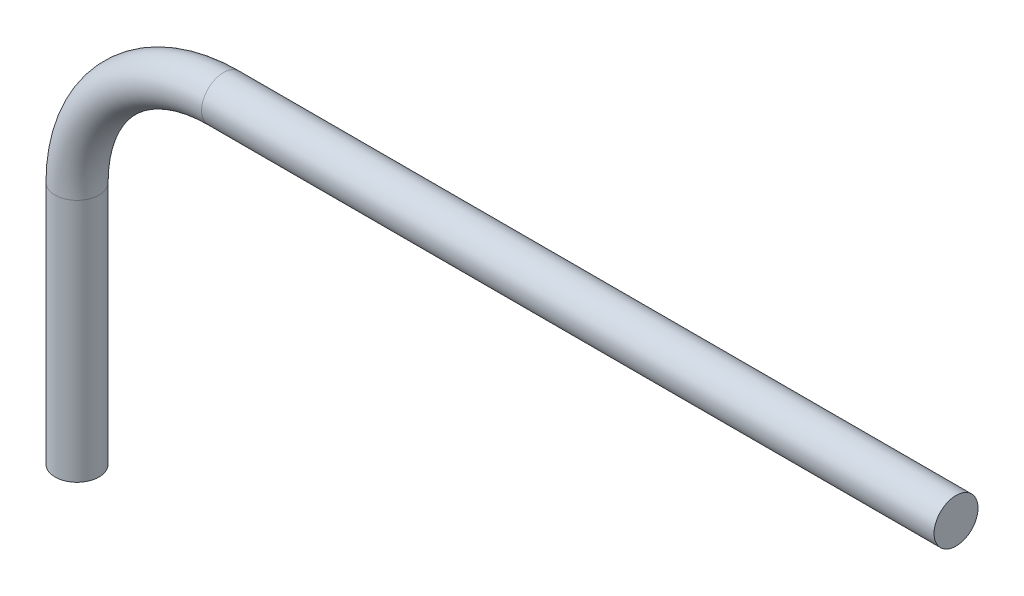
ISO-10303-21;
HEADER;
FILE_DESCRIPTION(('STEP AP214'),'2;1');
FILE_NAME('part.step','',(''),(''),'','','');
FILE_SCHEMA(('AUTOMOTIVE_DESIGN { 1 0 10303 214 1 1 1 1 }'));
ENDSEC;
DATA;
#1=APPLICATION_CONTEXT('core data for automotive mechanical design processes');
#2=APPLICATION_PROTOCOL_DEFINITION('international standard','automotive_design',2000,#1);
#3=PRODUCT_CONTEXT('',#1,'mechanical');
#4=PRODUCT('Part','Part','',(#3));
#5=PRODUCT_RELATED_PRODUCT_CATEGORY('part','',(#4));
#6=PRODUCT_DEFINITION_FORMATION('','',#4);
#7=PRODUCT_DEFINITION_CONTEXT('part definition',#1,'design');
#8=PRODUCT_DEFINITION('design','',#6,#7);
#9=PRODUCT_DEFINITION_SHAPE('','',#8);
#10=(LENGTH_UNIT() NAMED_UNIT(*) SI_UNIT(.MILLI.,.METRE.));
#11=(NAMED_UNIT(*) PLANE_ANGLE_UNIT() SI_UNIT($,.RADIAN.));
#12=(NAMED_UNIT(*) SI_UNIT($,.STERADIAN.) SOLID_ANGLE_UNIT());
#13=UNCERTAINTY_MEASURE_WITH_UNIT(LENGTH_MEASURE(1.E-05),#10,'distance_accuracy_value','');
#14=(GEOMETRIC_REPRESENTATION_CONTEXT(3) GLOBAL_UNCERTAINTY_ASSIGNED_CONTEXT((#13)) GLOBAL_UNIT_ASSIGNED_CONTEXT((#10,
#11,#12)) REPRESENTATION_CONTEXT('',''));
#15=CARTESIAN_POINT('',(0.,0.,0.));
#16=DIRECTION('',(0.,0.,1.));
#17=DIRECTION('',(1.,0.,0.));
#18=AXIS2_PLACEMENT_3D('',#15,#16,#17);
#19=CARTESIAN_POINT('',(0.,0.,0.));
#20=DIRECTION('',(0.,1.,0.));
#21=DIRECTION('',(0.,0.,1.));
#22=AXIS2_PLACEMENT_3D('',#19,#20,#21);
#23=PLANE('',#22);
#24=CARTESIAN_POINT('',(0.,0.,0.));
#25=DIRECTION('',(0.,1.,0.));
#26=DIRECTION('',(0.,0.,1.));
#27=AXIS2_PLACEMENT_3D('',#24,#25,#26);
#28=CIRCLE('',#27,4.5);
#29=CARTESIAN_POINT('',(0.,0.,4.5));
#30=VERTEX_POINT('',#29);
#31=EDGE_CURVE('E51',#30,#30,#28,.T.);
#32=ORIENTED_EDGE('',*,*,#31,.F.);
#33=EDGE_LOOP('',(#32));
#34=FACE_BOUND('',#33,.T.);
#35=ADVANCED_FACE('F37',(#34),#23,.F.);
#36=CARTESIAN_POINT('',(180.,80.,0.));
#37=DIRECTION('',(1.,0.,0.));
#38=DIRECTION('',(0.,0.,1.));
#39=AXIS2_PLACEMENT_3D('',#36,#37,#38);
#40=PLANE('',#39);
#41=CARTESIAN_POINT('',(180.,80.,0.));
#42=DIRECTION('',(1.,0.,0.));
#43=DIRECTION('',(0.,0.,1.));
#44=AXIS2_PLACEMENT_3D('',#41,#42,#43);
#45=CIRCLE('',#44,4.5);
#46=CARTESIAN_POINT('',(180.,80.,4.5));
#47=VERTEX_POINT('',#46);
#48=EDGE_CURVE('E10',#47,#47,#45,.T.);
#49=ORIENTED_EDGE('',*,*,#48,.T.);
#50=EDGE_LOOP('',(#49));
#51=FACE_BOUND('',#50,.T.);
#52=ADVANCED_FACE('F60',(#51),#40,.T.);
#53=CARTESIAN_POINT('',(0.,0.,0.));
#54=DIRECTION('',(0.,1.,0.));
#55=DIRECTION('',(0.,0.,1.));
#56=AXIS2_PLACEMENT_3D('',#53,#54,#55);
#57=CYLINDRICAL_SURFACE('',#56,4.5);
#58=CARTESIAN_POINT('',(0.,49.9999999999998,0.));
#59=DIRECTION('',(0.,1.,0.));
#60=DIRECTION('',(0.,0.,1.));
#61=AXIS2_PLACEMENT_3D('',#58,#59,#60);
#62=CIRCLE('',#61,4.5);
#63=CARTESIAN_POINT('',(-4.49999999999999,49.9999999999998,0.));
#64=VERTEX_POINT('',#63);
#65=EDGE_CURVE('E47',#64,#64,#62,.T.);
#66=ORIENTED_EDGE('',*,*,#65,.F.);
#67=EDGE_LOOP('',(#66));
#68=FACE_BOUND('',#67,.T.);
#69=ORIENTED_EDGE('',*,*,#31,.T.);
#70=EDGE_LOOP('',(#69));
#71=FACE_BOUND('',#70,.T.);
#72=ADVANCED_FACE('F57',(#68,#71),#57,.T.);
#73=CARTESIAN_POINT('',(30.,50.,0.));
#74=DIRECTION('',(0.,0.,-1.));
#75=DIRECTION('',(-1.,0.,0.));
#76=AXIS2_PLACEMENT_3D('',#73,#74,#75);
#77=TOROIDAL_SURFACE('',#76,30.,4.5);
#78=CARTESIAN_POINT('',(30.0000000000002,80.,0.));
#79=DIRECTION('',(1.,0.,0.));
#80=DIRECTION('',(0.,0.,1.));
#81=AXIS2_PLACEMENT_3D('',#78,#79,#80);
#82=CIRCLE('',#81,4.5);
#83=CARTESIAN_POINT('',(30.0000000000002,84.5,0.));
#84=VERTEX_POINT('',#83);
#85=EDGE_CURVE('E43',#84,#84,#82,.T.);
#86=CARTESIAN_POINT('',(30.,50.,0.));
#87=DIRECTION('',(0.,0.,-1.));
#88=DIRECTION('',(-1.,0.,0.));
#89=AXIS2_PLACEMENT_3D('',#86,#87,#88);
#90=CIRCLE('',#89,34.5);
#91=EDGE_CURVE('',#64,#84,#90,.T.);
#92=ORIENTED_EDGE('',*,*,#65,.T.);
#93=ORIENTED_EDGE('',*,*,#85,.F.);
#94=ORIENTED_EDGE('',*,*,#91,.T.);
#95=ORIENTED_EDGE('',*,*,#91,.F.);
#96=EDGE_LOOP('',(#92,#94,#93,#95));
#97=FACE_BOUND('',#96,.T.);
#98=ADVANCED_FACE('F66',(#97),#77,.T.);
#99=CARTESIAN_POINT('',(30.0000000000002,80.,0.));
#100=DIRECTION('',(1.,0.,0.));
#101=DIRECTION('',(0.,0.,-1.));
#102=AXIS2_PLACEMENT_3D('',#99,#100,#101);
#103=CYLINDRICAL_SURFACE('',#102,4.5);
#104=ORIENTED_EDGE('',*,*,#48,.F.);
#105=EDGE_LOOP('',(#104));
#106=FACE_BOUND('',#105,.T.);
#107=ORIENTED_EDGE('',*,*,#85,.T.);
#108=EDGE_LOOP('',(#107));
#109=FACE_BOUND('',#108,.T.);
#110=ADVANCED_FACE('F64',(#106,#109),#103,.T.);
#111=CLOSED_SHELL('',(#35,#52,#72,#98,#110));
#112=MANIFOLD_SOLID_BREP('B2',#111);
#113=ADVANCED_BREP_SHAPE_REPRESENTATION('',(#18,#112),#14);
#114=SHAPE_DEFINITION_REPRESENTATION(#9,#113);
ENDSEC;
END-ISO-10303-21;
